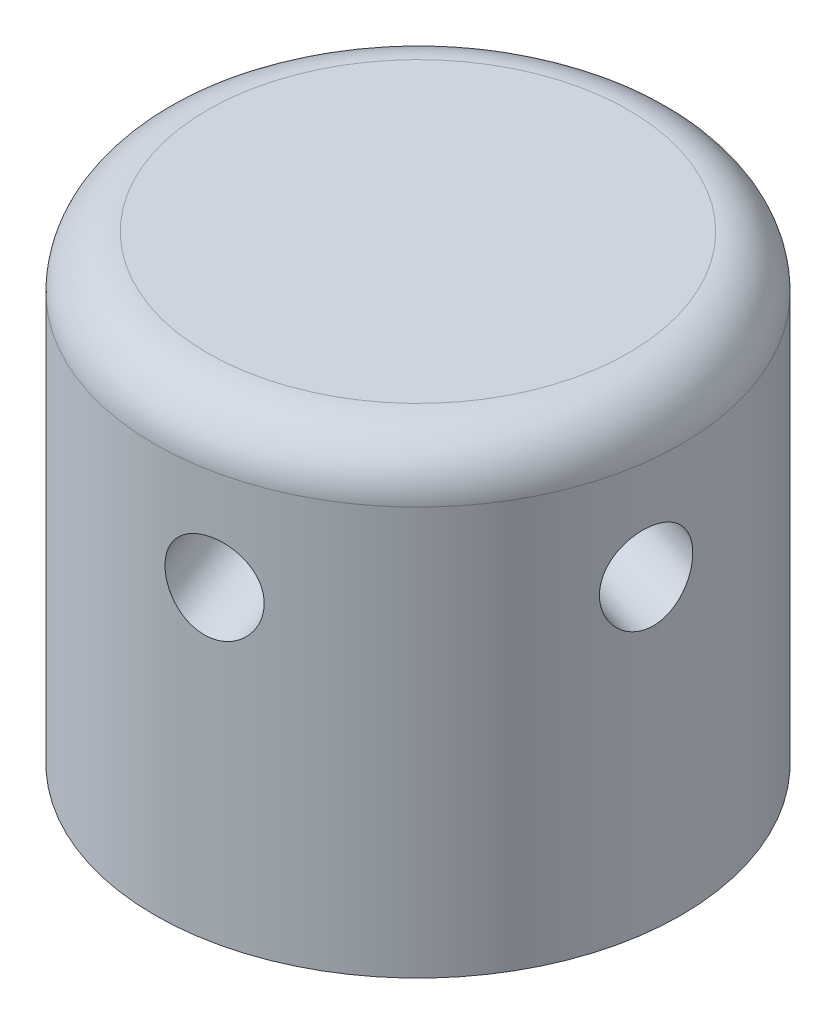
ISO-10303-21;
HEADER;
FILE_DESCRIPTION(('STEP AP214'),'2;1');
FILE_NAME('part.step','',(''),(''),'','','');
FILE_SCHEMA(('AUTOMOTIVE_DESIGN { 1 0 10303 214 1 1 1 1 }'));
ENDSEC;
DATA;
#1=APPLICATION_CONTEXT('core data for automotive mechanical design processes');
#2=APPLICATION_PROTOCOL_DEFINITION('international standard','automotive_design',2000,#1);
#3=PRODUCT_CONTEXT('',#1,'mechanical');
#4=PRODUCT('Part','Part','',(#3));
#5=PRODUCT_RELATED_PRODUCT_CATEGORY('part','',(#4));
#6=PRODUCT_DEFINITION_FORMATION('','',#4);
#7=PRODUCT_DEFINITION_CONTEXT('part definition',#1,'design');
#8=PRODUCT_DEFINITION('design','',#6,#7);
#9=PRODUCT_DEFINITION_SHAPE('','',#8);
#10=(LENGTH_UNIT() NAMED_UNIT(*) SI_UNIT(.MILLI.,.METRE.));
#11=(NAMED_UNIT(*) PLANE_ANGLE_UNIT() SI_UNIT($,.RADIAN.));
#12=(NAMED_UNIT(*) SI_UNIT($,.STERADIAN.) SOLID_ANGLE_UNIT());
#13=UNCERTAINTY_MEASURE_WITH_UNIT(LENGTH_MEASURE(1.E-05),#10,'distance_accuracy_value','');
#14=(GEOMETRIC_REPRESENTATION_CONTEXT(3) GLOBAL_UNCERTAINTY_ASSIGNED_CONTEXT((#13)) GLOBAL_UNIT_ASSIGNED_CONTEXT((#10,
#11,#12)) REPRESENTATION_CONTEXT('',''));
#15=CARTESIAN_POINT('',(0.,0.,0.));
#16=DIRECTION('',(0.,0.,1.));
#17=DIRECTION('',(1.,0.,0.));
#18=AXIS2_PLACEMENT_3D('',#15,#16,#17);
#19=CARTESIAN_POINT('',(0.,-6.,0.));
#20=DIRECTION('',(0.,1.,0.));
#21=DIRECTION('',(0.,0.,1.));
#22=AXIS2_PLACEMENT_3D('',#19,#20,#21);
#23=CYLINDRICAL_SURFACE('',#22,10.);
#24=CARTESIAN_POINT('',(0.,1.,0.));
#25=DIRECTION('',(0.,1.,0.));
#26=DIRECTION('',(0.,0.,1.));
#27=AXIS2_PLACEMENT_3D('',#24,#25,#26);
#28=CIRCLE('',#27,10.);
#29=CARTESIAN_POINT('',(0.,1.,10.));
#30=VERTEX_POINT('',#29);
#31=EDGE_CURVE('E10',#30,#30,#28,.F.);
#32=ORIENTED_EDGE('',*,*,#31,.T.);
#33=EDGE_LOOP('',(#32));
#34=FACE_BOUND('',#33,.T.);
#35=CARTESIAN_POINT('',(-6.18040658631982,-2.80419257592395,-7.8614613417465));
#36=CARTESIAN_POINT('',(-6.18041069378116,-2.90234784309518,-7.86145985033207));
#37=CARTESIAN_POINT('',(-6.18709037837394,-3.00057569421897,-7.85622071906424));
#38=CARTESIAN_POINT('',(-6.21328313433534,-3.19429375623175,-7.83552031582612));
#39=CARTESIAN_POINT('',(-6.23281569685475,-3.28977957900091,-7.82004351843738));
#40=CARTESIAN_POINT('',(-6.28376502842835,-3.47517276967888,-7.77916181257504));
#41=CARTESIAN_POINT('',(-6.31516706385408,-3.56508689335964,-7.75376921134334));
#42=CARTESIAN_POINT('',(-6.38865971296323,-3.73693258914234,-7.69332712533847));
#43=CARTESIAN_POINT('',(-6.4307480948599,-3.81886582307326,-7.65827965680337));
#44=CARTESIAN_POINT('',(-6.52448986893661,-3.97278415857681,-7.5785772815116));
#45=CARTESIAN_POINT('',(-6.57620342226979,-4.04470142029659,-7.53386164380033));
#46=CARTESIAN_POINT('',(-6.68725447470501,-4.17534392326118,-7.43546314485651));
#47=CARTESIAN_POINT('',(-6.74659001159406,-4.23407254914793,-7.38178259049963));
#48=CARTESIAN_POINT('',(-6.86747316238743,-4.33309816932697,-7.26940523116863));
#49=CARTESIAN_POINT('',(-6.92874101682425,-4.37420107240322,-7.21111983965897));
#50=CARTESIAN_POINT('',(-7.05399457373656,-4.44028699170343,-7.08863909005609));
#51=CARTESIAN_POINT('',(-7.1179783887015,-4.46528101377072,-7.02444780130276));
#52=CARTESIAN_POINT('',(-7.2408979989159,-4.4964619358335,-6.8975752553002));
#53=CARTESIAN_POINT('',(-7.2998114016746,-4.50403920222909,-6.835211852897));
#54=CARTESIAN_POINT('',(-7.41599656463583,-4.50415740699111,-6.70897494081218));
#55=CARTESIAN_POINT('',(-7.47326875792584,-4.49670234989006,-6.64510183778663));
#56=CARTESIAN_POINT('',(-7.58217917913624,-4.46774917979113,-6.52051620708892));
#57=CARTESIAN_POINT('',(-7.63395240425703,-4.44684381033082,-6.45978210248453));
#58=CARTESIAN_POINT('',(-7.73327325732892,-4.39246364343792,-6.34054506008151));
#59=CARTESIAN_POINT('',(-7.78082040703957,-4.35898742566933,-6.28204237522627));
#60=CARTESIAN_POINT('',(-7.87234067780815,-4.27943950635112,-6.1669959074082));
#61=CARTESIAN_POINT('',(-7.91614456968675,-4.23298937226029,-6.11058005058202));
#62=CARTESIAN_POINT('',(-7.99779809730484,-4.12962391405995,-6.00331398885442));
#63=CARTESIAN_POINT('',(-8.03564580230697,-4.0727052094075,-5.95246559029986));
#64=CARTESIAN_POINT('',(-8.10775604691805,-3.94529584290214,-5.85391396776607));
#65=CARTESIAN_POINT('',(-8.14151429694982,-3.87409566698231,-5.80675887231004));
#66=CARTESIAN_POINT('',(-8.20153607142322,-3.7234916320388,-5.72167140512811));
#67=CARTESIAN_POINT('',(-8.22779684344153,-3.64408477476704,-5.68374242118406));
#68=CARTESIAN_POINT('',(-8.27416487683236,-3.47360706993731,-5.61604816884507));
#69=CARTESIAN_POINT('',(-8.29374975039458,-3.38211206928312,-5.58698947660017));
#70=CARTESIAN_POINT('',(-8.32405447795391,-3.19457090082377,-5.54173833167562));
#71=CARTESIAN_POINT('',(-8.33477322064973,-3.09852416408824,-5.52554749189225));
#72=CARTESIAN_POINT('',(-8.34721005269621,-2.9032972349777,-5.50674303326532));
#73=CARTESIAN_POINT('',(-8.3488141503021,-2.80409289685924,-5.50430137103277));
#74=CARTESIAN_POINT('',(-8.34248086251898,-2.60668729118917,-5.51389588691072));
#75=CARTESIAN_POINT('',(-8.33454554272457,-2.50848581112888,-5.52592893077623));
#76=CARTESIAN_POINT('',(-8.30942286587974,-2.31961542955216,-5.56362998091201));
#77=CARTESIAN_POINT('',(-8.29257179549985,-2.22880300805648,-5.58880197157573));
#78=CARTESIAN_POINT('',(-8.24983112683427,-2.05390062311326,-5.65170093491985));
#79=CARTESIAN_POINT('',(-8.2239437144287,-1.96980903994349,-5.68942487119679));
#80=CARTESIAN_POINT('',(-8.16459239437144,-1.81433058777238,-5.77425211059514));
#81=CARTESIAN_POINT('',(-8.13148151790137,-1.74256485669541,-5.82090888833601));
#82=CARTESIAN_POINT('',(-8.05758249695944,-1.60987893076595,-5.92277904761302));
#83=CARTESIAN_POINT('',(-8.01679522194457,-1.54895750916636,-5.97799145998169));
#84=CARTESIAN_POINT('',(-7.9291356931972,-1.44084866104323,-6.09376440834493));
#85=CARTESIAN_POINT('',(-7.88240129647873,-1.39341115377824,-6.15419605110393));
#86=CARTESIAN_POINT('',(-7.78316118923601,-1.31197818446462,-6.27923276033472));
#87=CARTESIAN_POINT('',(-7.73065563818385,-1.27798235110665,-6.34383771146675));
#88=CARTESIAN_POINT('',(-7.62126393920933,-1.22444215000392,-6.47484261923763));
#89=CARTESIAN_POINT('',(-7.56439461267379,-1.20484509181928,-6.54123510023709));
#90=CARTESIAN_POINT('',(-7.44753128648001,-1.18040665367519,-6.67398645668238));
#91=CARTESIAN_POINT('',(-7.38753727259583,-1.17556534090098,-6.74034533197383));
#92=CARTESIAN_POINT('',(-7.26603697545491,-1.18076540289665,-6.87114840534427));
#93=CARTESIAN_POINT('',(-7.20452970867928,-1.1908167224365,-6.93559129467686));
#94=CARTESIAN_POINT('',(-7.08188582181877,-1.22556046932424,-7.06077720898353));
#95=CARTESIAN_POINT('',(-7.02074920150364,-1.25025288757539,-7.12152023625636));
#96=CARTESIAN_POINT('',(-6.90082161745449,-1.31362986693059,-7.23779262794899));
#97=CARTESIAN_POINT('',(-6.84203053304105,-1.3523137071329,-7.29332226080096));
#98=CARTESIAN_POINT('',(-6.72880950003165,-1.4426321301286,-7.39790984547475));
#99=CARTESIAN_POINT('',(-6.67437928718441,-1.49426592742231,-7.44696818954728));
#100=CARTESIAN_POINT('',(-6.57186287088399,-1.60901583583468,-7.53759282097776));
#101=CARTESIAN_POINT('',(-6.52377217819324,-1.67212374556233,-7.57916441768701));
#102=CARTESIAN_POINT('',(-6.43563400862007,-1.80807329481835,-7.65414747741365));
#103=CARTESIAN_POINT('',(-6.39558808462159,-1.88091680910276,-7.68755736524249));
#104=CARTESIAN_POINT('',(-6.32481099983414,-2.03460274266089,-7.74589484926247));
#105=CARTESIAN_POINT('',(-6.29412611305473,-2.11548235994557,-7.77078037939385));
#106=CARTESIAN_POINT('',(-6.24337632993539,-2.2825764910716,-7.8116145758641));
#107=CARTESIAN_POINT('',(-6.22330160238461,-2.36878598329015,-7.82757151610482));
#108=CARTESIAN_POINT('',(-6.19932412581324,-2.51357139572223,-7.84656075943516));
#109=CARTESIAN_POINT('',(-6.19222425836726,-2.57131759117338,-7.85215871739794));
#110=CARTESIAN_POINT('',(-6.18276429226737,-2.68743149130231,-7.85960943208847));
#111=CARTESIAN_POINT('',(-6.18040414275684,-2.74579918930468,-7.86146222900137));
#112=CARTESIAN_POINT('',(-6.18040658631982,-2.80419257592395,-7.8614613417465));
#113=B_SPLINE_CURVE_WITH_KNOTS('',3,(#35,#36,#37,#38,#39,#40,#41,#42,#43,#44,#45,#46,#47,#48,
#49,#50,#51,#52,#53,#54,#55,#56,#57,#58,#59,#60,#61,#62,#63,#64,#65,#66,#67,#68,#69,#70,#71,#72,
#73,#74,#75,#76,#77,#78,#79,#80,#81,#82,#83,#84,#85,#86,#87,#88,#89,#90,#91,#92,#93,#94,#95,#96,
#97,#98,#99,#100,#101,#102,#103,#104,#105,#106,#107,#108,#109,#110,#111,#112),.UNSPECIFIED.,.T.,
.F.,(4,2,2,2,2,2,2,2,2,2,2,2,2,2,2,2,2,2,2,2,2,2,2,2,2,2,2,2,2,2,2,2,2,2,2,2,2,2,4),(0.,
0.294247369480007,0.588941991186979,0.883272002128368,1.17754059429731,1.47371432417628,
1.76981195895846,2.05036159735739,2.33071935602934,2.58777759553048,2.84476736510533,
3.091142592679,3.33754566570429,3.59206194690359,3.84666056204866,4.12096676141902,
4.39537353311392,4.6879442991612,4.98055173114879,5.27681071896179,5.57300556860702,
5.85875072810492,6.1444268140438,6.41842323334606,6.69238863746758,6.9608803249332,
7.22936459513529,7.49686142113619,7.76435946509044,8.0320362152438,8.29971279908588,
8.56737559297647,8.83502215529133,9.10247815769814,9.36998573770895,9.63879501418435,
9.90735477750061,10.0824068686198,10.2574570814401),.UNSPECIFIED.);
#114=CARTESIAN_POINT('',(-6.18040658631982,-2.80419257592395,-7.8614613417465));
#115=VERTEX_POINT('',#114);
#116=EDGE_CURVE('E51',#115,#115,#113,.T.);
#117=ORIENTED_EDGE('',*,*,#116,.F.);
#118=EDGE_LOOP('',(#117));
#119=FACE_BOUND('',#118,.T.);
#120=CARTESIAN_POINT('',(5.56684336935079,-2.80419257592395,-8.30724111249428));
#121=CARTESIAN_POINT('',(5.56684068165602,-2.90234784309518,-8.30724455804975));
#122=CARTESIAN_POINT('',(5.5597938356678,-3.00057569421897,-8.31197833501099));
#123=CARTESIAN_POINT('',(5.53201257555666,-3.19429375623175,-8.33049234985681));
#124=CARTESIAN_POINT('',(5.51125737278652,-3.28977957900091,-8.34428632730922));
#125=CARTESIAN_POINT('',(5.4566323507206,-3.47517276967888,-8.38010887923268));
#126=CARTESIAN_POINT('',(5.42277878924899,-3.56508689335964,-8.40212724433727));
#127=CARTESIAN_POINT('',(5.34258447195922,-3.73693258914234,-8.45334527542134));
#128=CARTESIAN_POINT('',(5.29624632335746,-3.81886582307326,-8.48254344189732));
#129=CARTESIAN_POINT('',(5.19147705869946,-3.97278415857681,-8.54706777852483));
#130=CARTESIAN_POINT('',(5.13296959325439,-4.04470142029659,-8.58243239843604));
#131=CARTESIAN_POINT('',(5.0050703971945,-4.17534392326118,-8.65764141710136));
#132=CARTESIAN_POINT('',(4.93568146690598,-4.23407254914793,-8.69748466254382));
#133=CARTESIAN_POINT('',(4.79144929910144,-4.33309816932697,-8.77772485699988));
#134=CARTESIAN_POINT('',(4.7170837894715,-4.37420107240322,-8.81798287270117));
#135=CARTESIAN_POINT('',(4.56189219674915,-4.44028699170343,-8.89925745108069));
#136=CARTESIAN_POINT('',(4.48107056710181,-4.46528101377072,-8.94027347612491));
#137=CARTESIAN_POINT('',(4.32242335698893,-4.4964619358335,-9.01797119956537));
#138=CARTESIAN_POINT('',(4.24490699410614,-4.50403920222909,-9.05472982398652));
#139=CARTESIAN_POINT('',(4.08894536642164,-4.50415740699111,-9.12621912916599));
#140=CARTESIAN_POINT('',(4.01050035454146,-4.49670234989006,-9.16095034747861));
#141=CARTESIAN_POINT('',(3.85835720761111,-4.46774917979113,-9.2260312361227));
#142=CARTESIAN_POINT('',(3.78459683524983,-4.44684381033082,-9.25650262878254));
#143=CARTESIAN_POINT('',(3.64050383759365,-4.39246364343792,-9.31411610083902));
#144=CARTESIAN_POINT('',(3.57017160064663,-4.35898742566933,-9.34125780356576));
#145=CARTESIAN_POINT('',(3.43247458875423,-4.27943950635112,-9.39274743975472));
#146=CARTESIAN_POINT('',(3.36528377348706,-4.23298937226029,-9.41697395805344));
#147=CARTESIAN_POINT('',(3.23803535881906,-4.12962391405995,-9.46148404157961));
#148=CARTESIAN_POINT('',(3.17798007398682,-4.0727052094075,-9.48176632875859));
#149=CARTESIAN_POINT('',(3.06196862013124,-3.94529584290214,-9.51989312060143));
#150=CARTESIAN_POINT('',(3.00668958636109,-3.87409566698231,-9.53742739840558));
#151=CARTESIAN_POINT('',(2.90721884789784,-3.7234916320388,-9.56821802477057));
#152=CARTESIAN_POINT('',(2.86303121572234,-3.64408477476704,-9.58147280250344));
#153=CARTESIAN_POINT('',(2.78432164560611,-3.47360706993731,-9.60465274841332));
#154=CARTESIAN_POINT('',(2.75063312822817,-3.38211206928312,-9.61429944029751));
#155=CARTESIAN_POINT('',(2.69823205615212,-3.19457090082377,-9.62913757612075));
#156=CARTESIAN_POINT('',(2.67952137882051,-3.09852416408824,-9.63432846156183));
#157=CARTESIAN_POINT('',(2.65779408344942,-2.9032972349777,-9.64034569443597));
#158=CARTESIAN_POINT('',(2.6549762312517,-2.80409289685924,-9.64111676679244));
#159=CARTESIAN_POINT('',(2.66605825165337,-2.60668729118918,-9.63805832063582));
#160=CARTESIAN_POINT('',(2.67995450510481,-2.50848581112888,-9.63422979808496));
#161=CARTESIAN_POINT('',(2.72357366859686,-2.31961542955216,-9.62198697776265));
#162=CARTESIAN_POINT('',(2.7527209214665,-2.22880300805648,-9.61373923036864));
#163=CARTESIAN_POINT('',(2.82574898339175,-2.05390062311326,-9.59252728752533));
#164=CARTESIAN_POINT('',(2.86962622918195,-1.96980903994349,-9.57956423267128));
#165=CARTESIAN_POINT('',(2.96864229450736,-1.81433058777238,-9.54933083154011));
#166=CARTESIAN_POINT('',(3.02324735053505,-1.74256485669541,-9.5322582539377));
#167=CARTESIAN_POINT('',(3.1429676826702,-1.60987893076595,-9.49345571895933));
#168=CARTESIAN_POINT('',(3.20808176836764,-1.54895750916636,-9.47172628899688));
#169=CARTESIAN_POINT('',(3.34527666942103,-1.44084866104323,-9.42413293149946));
#170=CARTESIAN_POINT('',(3.41719229986527,-1.39341115377824,-9.39836028357576));
#171=CARTESIAN_POINT('',(3.56677615661691,-1.31197818446462,-9.34261580097778));
#172=CARTESIAN_POINT('',(3.64444422395009,-1.27798235110665,-9.31264408232851));
#173=CARTESIAN_POINT('',(3.80284118917892,-1.22444215000392,-9.24908913703792));
#174=CARTESIAN_POINT('',(3.88355777922459,-1.20484509181928,-9.21551959838653));
#175=CARTESIAN_POINT('',(4.04592457563197,-1.18040665367519,-9.14539839566193));
#176=CARTESIAN_POINT('',(4.12757478624289,-1.17556534090098,-9.10884671801134));
#177=CARTESIAN_POINT('',(4.28952155816144,-1.18076540289665,-9.03371344127161));
#178=CARTESIAN_POINT('',(4.36981717870131,-1.1908167224365,-8.99513050237554));
#179=CARTESIAN_POINT('',(4.52677510354713,-1.22556046932424,-8.91717380957021));
#180=CARTESIAN_POINT('',(4.60343741011047,-1.25025288757539,-8.87780005615232));
#181=CARTESIAN_POINT('',(4.75107868746049,-1.31362986693059,-8.79967229086849));
#182=CARTESIAN_POINT('',(4.82205795083332,-1.3523137071329,-8.76091824717969));
#183=CARTESIAN_POINT('',(4.95651387808148,-1.4426321301286,-8.68555798701926));
#184=CARTESIAN_POINT('',(5.01999099666755,-1.49426592742231,-8.64895164044187));
#185=CARTESIAN_POINT('',(5.1378594577656,-1.60901583583468,-8.57945728591311));
#186=CARTESIAN_POINT('',(5.19225723702143,-1.67212374556233,-8.54656664912289));
#187=CARTESIAN_POINT('',(5.29080655683742,-1.80807329481835,-8.48591330836175));
#188=CARTESIAN_POINT('',(5.3349561194367,-1.88091680910276,-8.45815159451121));
#189=CARTESIAN_POINT('',(5.41230968576981,-2.03460274266089,-8.40886586079098));
#190=CARTESIAN_POINT('',(5.44545938284803,-2.11548235994557,-8.38737285099227));
#191=CARTESIAN_POINT('',(5.49997755693345,-2.2825764910716,-8.35172539971701));
#192=CARTESIAN_POINT('',(5.52135694090016,-2.36878598329015,-8.3375641649796));
#193=CARTESIAN_POINT('',(5.54682623225177,-2.51357139572223,-8.32062822854148));
#194=CARTESIAN_POINT('',(5.55434418634884,-2.57131759117338,-8.31560571748645));
#195=CARTESIAN_POINT('',(5.5643535273974,-2.68743149130231,-8.30891115254283));
#196=CARTESIAN_POINT('',(5.56684496828281,-2.74579918930467,-8.30723906270461));
#197=CARTESIAN_POINT('',(5.56684336935079,-2.80419257592395,-8.30724111249428));
#198=B_SPLINE_CURVE_WITH_KNOTS('',3,(#120,#121,#122,#123,#124,#125,#126,#127,#128,#129,#130,
#131,#132,#133,#134,#135,#136,#137,#138,#139,#140,#141,#142,#143,#144,#145,#146,#147,#148,#149,
#150,#151,#152,#153,#154,#155,#156,#157,#158,#159,#160,#161,#162,#163,#164,#165,#166,#167,#168,
#169,#170,#171,#172,#173,#174,#175,#176,#177,#178,#179,#180,#181,#182,#183,#184,#185,#186,#187,
#188,#189,#190,#191,#192,#193,#194,#195,#196,#197),.UNSPECIFIED.,.T.,.F.,(4,2,2,2,2,2,2,2,2,2,2,
2,2,2,2,2,2,2,2,2,2,2,2,2,2,2,2,2,2,2,2,2,2,2,2,2,2,2,4),(0.,0.294247369480007,
0.588941991186979,0.883272002128369,1.17754059429731,1.47371432417628,1.76981195895846,
2.05036159735739,2.33071935602934,2.58777759553048,2.84476736510533,3.091142592679,
3.33754566570429,3.59206194690359,3.84666056204865,4.12096676141902,4.39537353311392,
4.6879442991612,4.98055173114879,5.27681071896179,5.57300556860702,5.85875072810493,
6.1444268140438,6.41842323334606,6.69238863746758,6.9608803249332,7.22936459513529,
7.49686142113619,7.76435946509044,8.0320362152438,8.29971279908588,8.56737559297647,
8.83502215529133,9.10247815769814,9.36998573770895,9.63879501418435,9.90735477750061,
10.0824068686198,10.2574570814401),.UNSPECIFIED.);
#199=CARTESIAN_POINT('',(5.56684336935079,-2.80419257592395,-8.30724111249428));
#200=VERTEX_POINT('',#199);
#201=EDGE_CURVE('E58',#200,#200,#198,.T.);
#202=ORIENTED_EDGE('',*,*,#201,.F.);
#203=EDGE_LOOP('',(#202));
#204=FACE_BOUND('',#203,.T.);
#205=CARTESIAN_POINT('',(9.92735308998561,-4.50322630338943,1.20318769390029));
#206=CARTESIAN_POINT('',(9.93747158086751,-4.50611583843854,1.11968976236709));
#207=CARTESIAN_POINT('',(9.94656365977674,-4.50178304837939,1.03576684298313));
#208=CARTESIAN_POINT('',(9.9624661113616,-4.47884815399744,0.869629076678414));
#209=CARTESIAN_POINT('',(9.96927428677865,-4.46023236479396,0.787415945583453));
#210=CARTESIAN_POINT('',(9.98062867071901,-4.40963627823444,0.627282609305299));
#211=CARTESIAN_POINT('',(9.98518021682377,-4.37768784959331,0.549352665483974));
#212=CARTESIAN_POINT('',(9.99229678886943,-4.30173146568903,0.399548007862778));
#213=CARTESIAN_POINT('',(9.99486174569541,-4.25772309092354,0.327673504813696));
#214=CARTESIAN_POINT('',(9.99846782325065,-4.15722061048359,0.188834448148186));
#215=CARTESIAN_POINT('',(9.99944461795647,-4.10030129130652,0.122176792796474));
#216=CARTESIAN_POINT('',(10.000191736081,-3.97687044676209,-0.00157118390889282));
#217=CARTESIAN_POINT('',(9.99996165377224,-3.91035570291724,-0.0586582811790618));
#218=CARTESIAN_POINT('',(9.99877298805763,-3.76384268192975,-0.166355199607757));
#219=CARTESIAN_POINT('',(9.99775735406143,-3.68319042631406,-0.216075988456209));
#220=CARTESIAN_POINT('',(9.99553162089881,-3.51496774271233,-0.301993473386273));
#221=CARTESIAN_POINT('',(9.994321459765,-3.42739511474905,-0.338185847680939));
#222=CARTESIAN_POINT('',(9.99214475836298,-3.24336619318965,-0.397457240081453));
#223=CARTESIAN_POINT('',(9.99119221933799,-3.1466860486199,-0.419845630271941));
#224=CARTESIAN_POINT('',(9.98997443116463,-2.95091352349595,-0.447898162480002));
#225=CARTESIAN_POINT('',(9.98970915334956,-2.85182124372955,-0.453563002063254));
#226=CARTESIAN_POINT('',(9.98997568776477,-2.65525702638746,-0.447654862845942));
#227=CARTESIAN_POINT('',(9.99049850373749,-2.55777945013346,-0.436276445782735));
#228=CARTESIAN_POINT('',(9.99215335482241,-2.36634287483814,-0.396564915311679));
#229=CARTESIAN_POINT('',(9.99328522731719,-2.27238294374863,-0.368236327354412));
#230=CARTESIAN_POINT('',(9.99565636177197,-2.09496299673918,-0.29675815295416));
#231=CARTESIAN_POINT('',(9.99688892730428,-2.01122538412609,-0.254297055812373));
#232=CARTESIAN_POINT('',(9.99891334558655,-1.85241205398823,-0.15544858565793));
#233=CARTESIAN_POINT('',(9.99970528156228,-1.77733470284466,-0.0990638454394953));
#234=CARTESIAN_POINT('',(10.0001535387467,-1.64051789357053,0.0238823714026653));
#235=CARTESIAN_POINT('',(9.99984675535424,-1.57841786272032,0.0900429836730085));
#236=CARTESIAN_POINT('',(9.99756202838942,-1.46630729881969,0.23189170496111));
#237=CARTESIAN_POINT('',(9.99558420163241,-1.4162959210183,0.307579147684775));
#238=CARTESIAN_POINT('',(9.9894764346614,-1.33027339058666,0.465306593080012));
#239=CARTESIAN_POINT('',(9.98537168516191,-1.2941067981997,0.547262868864093));
#240=CARTESIAN_POINT('',(9.97469882670128,-1.23592461440921,0.715901872032833));
#241=CARTESIAN_POINT('',(9.96813073798167,-1.21390890673034,0.802584560575034));
#242=CARTESIAN_POINT('',(9.95243946460123,-1.18461552438532,0.978112721952867));
#243=CARTESIAN_POINT('',(9.94331817823612,-1.17732693310918,1.0669565433517));
#244=CARTESIAN_POINT('',(9.92268067853598,-1.17764248148586,1.24433950491424));
#245=CARTESIAN_POINT('',(9.9111644558854,-1.18524667906793,1.33287864389147));
#246=CARTESIAN_POINT('',(9.88615666531998,-1.21516102778183,1.50720523339001));
#247=CARTESIAN_POINT('',(9.87266392129036,-1.23747996268658,1.59299100823057));
#248=CARTESIAN_POINT('',(9.8443798474004,-1.29624869601392,1.75934922279337));
#249=CARTESIAN_POINT('',(9.82958853329444,-1.33269832301985,1.83992172574296));
#250=CARTESIAN_POINT('',(9.79958146819504,-1.41872943258444,1.99357342171471));
#251=CARTESIAN_POINT('',(9.78436595790433,-1.46830359828222,2.06665675851568));
#252=CARTESIAN_POINT('',(9.75448615573963,-1.57922779388592,2.20338517182545));
#253=CARTESIAN_POINT('',(9.73982184666737,-1.64057745601468,2.26703054299466));
#254=CARTESIAN_POINT('',(9.71204281917471,-1.77334593453038,2.3832340763728));
#255=CARTESIAN_POINT('',(9.69892869479173,-1.84476858808605,2.43578799430921));
#256=CARTESIAN_POINT('',(9.67517431857508,-1.99561388433194,2.52849769883648));
#257=CARTESIAN_POINT('',(9.66453409775658,-2.07503662730087,2.5686533299929));
#258=CARTESIAN_POINT('',(9.64636774595636,-2.24043354768507,2.63606282413499));
#259=CARTESIAN_POINT('',(9.63887350834762,-2.32646483157541,2.66318493730356));
#260=CARTESIAN_POINT('',(9.62763461524281,-2.50195468590873,2.7035333093719));
#261=CARTESIAN_POINT('',(9.62389048520026,-2.59141373481684,2.71675762096731));
#262=CARTESIAN_POINT('',(9.62028554157676,-2.77404457649806,2.72949698535217));
#263=CARTESIAN_POINT('',(9.62054338150975,-2.86724772045195,2.72859315038128));
#264=CARTESIAN_POINT('',(9.62512160451679,-3.05229313121454,2.71239749907065));
#265=CARTESIAN_POINT('',(9.62944296169443,-3.14413506635284,2.69710223282622));
#266=CARTESIAN_POINT('',(9.64203841119566,-3.32803733023408,2.65173003156967));
#267=CARTESIAN_POINT('',(9.65047469065912,-3.41993678405649,2.62104497712594));
#268=CARTESIAN_POINT('',(9.67069145979926,-3.59730393228497,2.54543724825957));
#269=CARTESIAN_POINT('',(9.68247270396796,-3.68277017010274,2.50051136140061));
#270=CARTESIAN_POINT('',(9.70881886923832,-3.84670132949995,2.39620308017121));
#271=CARTESIAN_POINT('',(9.72344054533483,-3.92496503751464,2.33651768067541));
#272=CARTESIAN_POINT('',(9.75422250490331,-4.06967581198045,2.20447803636209));
#273=CARTESIAN_POINT('',(9.77038291520708,-4.13612190305521,2.13212274680237));
#274=CARTESIAN_POINT('',(9.80248646043133,-4.25247409998337,1.97917783489853));
#275=CARTESIAN_POINT('',(9.81841739257082,-4.3028778508246,1.8989652082616));
#276=CARTESIAN_POINT('',(9.84949876089979,-4.38788221630196,1.73050781058989));
#277=CARTESIAN_POINT('',(9.8646505948503,-4.42251207536418,1.64227827016818));
#278=CARTESIAN_POINT('',(9.88779604627379,-4.46447792520214,1.49492175671137));
#279=CARTESIAN_POINT('',(9.89633516158305,-4.47718169552662,1.43735988808217));
#280=CARTESIAN_POINT('',(9.91253806276659,-4.49553453526019,1.32099860608937));
#281=CARTESIAN_POINT('',(9.92020191554303,-4.50118414419441,1.26219928771976));
#282=CARTESIAN_POINT('',(9.92735308998561,-4.50322630338943,1.20318769390029));
#283=B_SPLINE_CURVE_WITH_KNOTS('',3,(#205,#206,#207,#208,#209,#210,#211,#212,#213,#214,#215,
#216,#217,#218,#219,#220,#221,#222,#223,#224,#225,#226,#227,#228,#229,#230,#231,#232,#233,#234,
#235,#236,#237,#238,#239,#240,#241,#242,#243,#244,#245,#246,#247,#248,#249,#250,#251,#252,#253,
#254,#255,#256,#257,#258,#259,#260,#261,#262,#263,#264,#265,#266,#267,#268,#269,#270,#271,#272,
#273,#274,#275,#276,#277,#278,#279,#280,#281,#282),.UNSPECIFIED.,.T.,.F.,(4,2,2,2,2,2,2,2,2,2,2,
2,2,2,2,2,2,2,2,2,2,2,2,2,2,2,2,2,2,2,2,2,2,2,2,2,2,2,4),(0.,0.252248403203044,0.50473879386721,
0.756629088117827,1.00852814542465,1.27039654907248,1.53235299318959,1.8153580038218,
2.09845334611585,2.39475726963461,2.69104883367463,2.98398368367868,3.27684035918863,
3.55712444850328,3.83735557997979,4.10826598771179,4.37915745884014,4.6469115111212,
4.9146633632858,5.18221666901757,5.44977101546732,5.71748521982135,5.98519617668867,
6.25275819925242,6.5203118665682,6.78796773148794,7.05562695181105,7.325937691841,
7.59628630168278,7.87466534218203,8.15311113253284,8.44354639949903,8.73404722931547,
9.03109548314861,9.32816824272804,9.6148399080652,9.9009779057113,10.0792663817537,
10.2575412208797),.UNSPECIFIED.);
#284=CARTESIAN_POINT('',(9.92735308998561,-4.50322630338943,1.20318769390029));
#285=VERTEX_POINT('',#284);
#286=EDGE_CURVE('E93',#285,#285,#283,.T.);
#287=ORIENTED_EDGE('',*,*,#286,.F.);
#288=EDGE_LOOP('',(#287));
#289=FACE_BOUND('',#288,.T.);
#290=CARTESIAN_POINT('',(1.8869488312424,-1.17988271041713,9.820357636475));
#291=CARTESIAN_POINT('',(1.79945112973037,-1.18475788519567,9.83716851436081));
#292=CARTESIAN_POINT('',(1.71207388780583,-1.1970615964251,9.85273427537302));
#293=CARTESIAN_POINT('',(1.54011446951967,-1.23623501154644,9.88107607464319));
#294=CARTESIAN_POINT('',(1.45553513038818,-1.26311904764654,9.8938493505731));
#295=CARTESIAN_POINT('',(1.29172968985668,-1.33074121411888,9.91656548624668));
#296=CARTESIAN_POINT('',(1.21250170286714,-1.37147443377837,9.92650934696596));
#297=CARTESIAN_POINT('',(1.06173684355278,-1.46568816415508,9.94376591611577));
#298=CARTESIAN_POINT('',(0.990198215564106,-1.51916575601907,9.95107922606232));
#299=CARTESIAN_POINT('',(0.856928562793338,-1.63736917986167,9.96344117134831));
#300=CARTESIAN_POINT('',(0.795194342733254,-1.70209133275477,9.96849054549149));
#301=CARTESIAN_POINT('',(0.68328916963773,-1.84095631188058,9.97678675316516));
#302=CARTESIAN_POINT('',(0.633118430497758,-1.91509931233605,9.98003355335411));
#303=CARTESIAN_POINT('',(0.545463334213141,-2.07109010181131,9.98520987540477));
#304=CARTESIAN_POINT('',(0.508047312370339,-2.15297648026065,9.98713235637642));
#305=CARTESIAN_POINT('',(0.447138725622041,-2.32178014588872,9.99004511315271));
#306=CARTESIAN_POINT('',(0.423647416805992,-2.40869788614929,9.99103530486424));
#307=CARTESIAN_POINT('',(0.390591417550573,-2.58715311039519,9.99238320734883));
#308=CARTESIAN_POINT('',(0.381350410993514,-2.67875046191643,9.9927262563929));
#309=CARTESIAN_POINT('',(0.377720989293566,-2.86223482854569,9.99286381786895));
#310=CARTESIAN_POINT('',(0.383335721731672,-2.95412190091889,9.99265821405422));
#311=CARTESIAN_POINT('',(0.409498262249908,-3.13958461146535,9.99162097134035));
#312=CARTESIAN_POINT('',(0.430648645751802,-3.23307511652322,9.9907640208221));
#313=CARTESIAN_POINT('',(0.487770991347369,-3.41541140782257,9.98813748471376));
#314=CARTESIAN_POINT('',(0.523746946708113,-3.50425593539916,9.98636765320688));
#315=CARTESIAN_POINT('',(0.61102164830908,-3.67793018914257,9.98141395066469));
#316=CARTESIAN_POINT('',(0.662807753092569,-3.76251443694909,9.97818324657079));
#317=CARTESIAN_POINT('',(0.779887302249498,-3.92167683340661,9.96971466213185));
#318=CARTESIAN_POINT('',(0.845181587810698,-3.99625435843725,9.96447665676988));
#319=CARTESIAN_POINT('',(0.986696434114059,-4.13189888314325,9.95145224670999));
#320=CARTESIAN_POINT('',(1.06275908429531,-4.19313332764407,9.94370088320829));
#321=CARTESIAN_POINT('',(1.22439088781583,-4.30081455654523,9.92509236242018));
#322=CARTESIAN_POINT('',(1.30995475224262,-4.34726951292676,9.91423692778642));
#323=CARTESIAN_POINT('',(1.48149520274686,-4.42039515155083,9.89000123370738));
#324=CARTESIAN_POINT('',(1.56700117290235,-4.44824673456581,9.87685818054688));
#325=CARTESIAN_POINT('',(1.74117212114859,-4.48785940730089,9.8476440814622));
#326=CARTESIAN_POINT('',(1.82983527128239,-4.49962965729237,9.83157470834974));
#327=CARTESIAN_POINT('',(2.00061640842381,-4.50620850746607,9.79819054534492));
#328=CARTESIAN_POINT('',(2.08272613451838,-4.50222396319129,9.78105977801961));
#329=CARTESIAN_POINT('',(2.24465436031334,-4.48016765933825,9.7451732958157));
#330=CARTESIAN_POINT('',(2.3244730679195,-4.46209718225012,9.72641772900934));
#331=CARTESIAN_POINT('',(2.4786521356151,-4.41300188845494,9.68826715227286));
#332=CARTESIAN_POINT('',(2.55306887208699,-4.38214423029697,9.66888326539049));
#333=CARTESIAN_POINT('',(2.69584433373164,-4.30871265039763,9.63005220169523));
#334=CARTESIAN_POINT('',(2.7642017989999,-4.26613629950782,9.61060501258733));
#335=CARTESIAN_POINT('',(2.89714975163433,-4.16803837314638,9.57139471127444));
#336=CARTESIAN_POINT('',(2.96131666972515,-4.11192663970629,9.55167460859289));
#337=CARTESIAN_POINT('',(3.08028130015328,-3.99002612270598,9.51397759575605));
#338=CARTESIAN_POINT('',(3.13507556550246,-3.92423379538252,9.49600132797994));
#339=CARTESIAN_POINT('',(3.23839582013824,-3.77916184450483,9.46128964444992));
#340=CARTESIAN_POINT('',(3.28607166204278,-3.69922470291531,9.4447679979217));
#341=CARTESIAN_POINT('',(3.36861333681781,-3.53231996698333,9.41564471149395));
#342=CARTESIAN_POINT('',(3.40347519681208,-3.44535020240932,9.40304428752458));
#343=CARTESIAN_POINT('',(3.46100545316147,-3.26225642729358,9.38202713505441));
#344=CARTESIAN_POINT('',(3.48300099583673,-3.16589303513736,9.37384277009261));
#345=CARTESIAN_POINT('',(3.51136017725102,-2.97057074708831,9.36325710649527));
#346=CARTESIAN_POINT('',(3.51772416167656,-2.87161190864178,9.36085567997208));
#347=CARTESIAN_POINT('',(3.51433178540988,-2.6749381347884,9.36212990295936));
#348=CARTESIAN_POINT('',(3.50472924620439,-2.57722036376153,9.36574756478833));
#349=CARTESIAN_POINT('',(3.46954388654891,-2.38510669647371,9.37883870164833));
#350=CARTESIAN_POINT('',(3.44396531298001,-2.29070992443957,9.38831062044557));
#351=CARTESIAN_POINT('',(3.37861378028614,-2.1122239181654,9.41201963799943));
#352=CARTESIAN_POINT('',(3.33949209244676,-2.02786686659047,9.42603649247039));
#353=CARTESIAN_POINT('',(3.24775543901786,-1.86767474776899,9.45803536700821));
#354=CARTESIAN_POINT('',(3.19514350676156,-1.79183777025694,9.47601649556559));
#355=CARTESIAN_POINT('',(3.07977465382465,-1.65347380868961,9.51412324241499));
#356=CARTESIAN_POINT('',(3.01742430032603,-1.59058146667273,9.53415496109062));
#357=CARTESIAN_POINT('',(2.88299644381022,-1.47678152203921,9.57566018822197));
#358=CARTESIAN_POINT('',(2.81091766961876,-1.42587548801578,9.5971338849107));
#359=CARTESIAN_POINT('',(2.6599187612638,-1.33802625594269,9.64006834607164));
#360=CARTESIAN_POINT('',(2.58108928316139,-1.30092554630175,9.66152627940089));
#361=CARTESIAN_POINT('',(2.41807071745498,-1.24086915211944,9.70360732041632));
#362=CARTESIAN_POINT('',(2.33388706771279,-1.21789936112565,9.72423124138736));
#363=CARTESIAN_POINT('',(2.18892071746701,-1.19146477335558,9.75768152617976));
#364=CARTESIAN_POINT('',(2.12890975904827,-1.18417271969729,9.77095423583315));
#365=CARTESIAN_POINT('',(2.00822954382959,-1.17669311347785,9.79646967199437));
#366=CARTESIAN_POINT('',(1.94756028556266,-1.17650557675206,9.8087123962064));
#367=CARTESIAN_POINT('',(1.8869488312424,-1.17988271041713,9.820357636475));
#368=B_SPLINE_CURVE_WITH_KNOTS('',3,(#290,#291,#292,#293,#294,#295,#296,#297,#298,#299,#300,
#301,#302,#303,#304,#305,#306,#307,#308,#309,#310,#311,#312,#313,#314,#315,#316,#317,#318,#319,
#320,#321,#322,#323,#324,#325,#326,#327,#328,#329,#330,#331,#332,#333,#334,#335,#336,#337,#338,
#339,#340,#341,#342,#343,#344,#345,#346,#347,#348,#349,#350,#351,#352,#353,#354,#355,#356,#357,
#358,#359,#360,#361,#362,#363,#364,#365,#366,#367),.UNSPECIFIED.,.T.,.F.,(4,2,2,2,2,2,2,2,2,2,2,
2,2,2,2,2,2,2,2,2,2,2,2,2,2,2,2,2,2,2,2,2,2,2,2,2,2,2,4),(0.,0.267469811619867,
0.535203019253906,0.802841391544759,1.07041852522662,1.33790827518966,1.60540297264682,
1.87430908120209,2.14323944294974,2.41819277890536,2.69320437565799,2.97948684341757,
3.26584647179837,3.56211992190501,3.85841182724718,4.15073869864069,4.4429036524975,
4.71409391774852,4.98512964272775,5.23582093139192,5.48648939788596,5.73397953571808,
5.98152101405834,6.24288684630809,6.50434859557287,6.78669252311201,7.06912391551495,
7.36524356240143,7.6613566606451,7.95463350173544,8.24783241472102,8.52853798326313,
8.80918048934631,9.08026442131184,9.35138380909724,9.61930742364079,9.88696314259754,
10.0722445597595,10.2575263898977),.UNSPECIFIED.);
#369=CARTESIAN_POINT('',(1.8869488312424,-1.17988271041713,9.820357636475));
#370=VERTEX_POINT('',#369);
#371=EDGE_CURVE('E99',#370,#370,#368,.T.);
#372=ORIENTED_EDGE('',*,*,#371,.F.);
#373=EDGE_LOOP('',(#372));
#374=FACE_BOUND('',#373,.T.);
#375=CARTESIAN_POINT('',(-9.38654470399012,-2.80419257592395,3.44859080205164));
#376=CARTESIAN_POINT('',(-9.38654455484606,-2.90234784309518,3.44859516935191));
#377=CARTESIAN_POINT('',(-9.38362598097031,-3.00057569421897,3.45656690750819));
#378=CARTESIAN_POINT('',(-9.37203273430235,-3.19429375623175,3.487874475136));
#379=CARTESIAN_POINT('',(-9.36334931905659,-3.28977957900091,3.51123363941165));
#380=CARTESIAN_POINT('',(-9.34021271560724,-3.47517276967888,3.57232247507611));
#381=CARTESIAN_POINT('',(-9.32576667934466,-3.56508689335964,3.61003433080466));
#382=CARTESIAN_POINT('',(-9.29099331712761,-3.73693258914234,3.69860762539069));
#383=CARTESIAN_POINT('',(-9.27066721906947,-3.81886582307326,3.74946631864099));
#384=CARTESIAN_POINT('',(-9.22383355695659,-3.97278415857681,3.86324943218292));
#385=CARTESIAN_POINT('',(-9.19728682515046,-4.04470142029659,3.92624983602832));
#386=CARTESIAN_POINT('',(-9.13802095398199,-4.17534392326119,4.0622724714829));
#387=CARTESIAN_POINT('',(-9.10530340223162,-4.23407254914793,4.13529212405285));
#388=CARTESIAN_POINT('',(-9.03578113028456,-4.33309816932697,4.28498534614143));
#389=CARTESIAN_POINT('',(-8.99928123711436,-4.37420107240322,4.36126571484327));
#390=CARTESIAN_POINT('',(-8.92150059977564,-4.44028699170343,4.51823755944494));
#391=CARTESIAN_POINT('',(-8.88022314250651,-4.46528101377073,4.59892598272038));
#392=CARTESIAN_POINT('',(-8.79754442939001,-4.4964619358335,4.75503525182965));
#393=CARTESIAN_POINT('',(-8.75643855180501,-4.5040392022291,4.83033657859006));
#394=CARTESIAN_POINT('',(-8.672283303819,-4.50415740699111,4.97984458607279));
#395=CARTESIAN_POINT('',(-8.6292344540023,-4.49670234989006,5.05405155302212));
#396=CARTESIAN_POINT('',(-8.54440164910905,-4.46774917979113,5.19613059594724));
#397=CARTESIAN_POINT('',(-8.50263888957961,-4.44684381033082,5.26413772952888));
#398=CARTESIAN_POINT('',(-8.41992955491349,-4.39246364343792,5.39544374650843));
#399=CARTESIAN_POINT('',(-8.37898307255584,-4.35898742566933,5.45874209690884));
#400=CARTESIAN_POINT('',(-8.29784869865801,-4.27943950635112,5.58133436049499));
#401=CARTESIAN_POINT('',(-8.25773017741134,-4.23298937226029,5.64042779581673));
#402=CARTESIAN_POINT('',(-8.18094641811264,-4.12962391405996,5.7512319513299));
#403=CARTESIAN_POINT('',(-8.1442823013679,-4.0727052094075,5.80294027708911));
#404=CARTESIAN_POINT('',(-8.07283742961904,-3.94529584290214,5.90197532130427));
#405=CARTESIAN_POINT('',(-8.03842214176924,-3.87409566698231,5.948653050843));
#406=CARTESIAN_POINT('',(-7.97604689999563,-3.7234916320388,6.03203062394306));
#407=CARTESIAN_POINT('',(-7.94808931749826,-3.64408477476704,6.0687268029121));
#408=CARTESIAN_POINT('',(-7.89803676800905,-3.47360706993731,6.13374409761049));
#409=CARTESIAN_POINT('',(-7.87645236815793,-3.38211206928312,6.16135004897064));
#410=CARTESIAN_POINT('',(-7.84278064773336,-3.19457090082377,6.20415493038711));
#411=CARTESIAN_POINT('',(-7.83069451770443,-3.09852416408824,6.21935230512072));
#412=CARTESIAN_POINT('',(-7.81665360725043,-2.9032972349777,6.23699133256634));
#413=CARTESIAN_POINT('',(-7.81482714189443,-2.80409289685925,6.23927143517157));
#414=CARTESIAN_POINT('',(-7.8219949751856,-2.60668729118918,6.23028325209678));
#415=CARTESIAN_POINT('',(-7.83098693129249,-2.50848581112889,6.21901789944892));
#416=CARTESIAN_POINT('',(-7.85907942660605,-2.31961542955216,6.18347454873112));
#417=CARTESIAN_POINT('',(-7.8778121452341,-2.22880300805648,6.15966965554244));
#418=CARTESIAN_POINT('',(-7.92442502122213,-2.05390062311326,6.09958401549534));
#419=CARTESIAN_POINT('',(-7.9523029662649,-1.96980903994349,6.0633062858327));
#420=CARTESIAN_POINT('',(-8.01463789851775,-1.81433058777238,5.98064676758153));
#421=CARTESIAN_POINT('',(-8.04877930748964,-1.74256485669541,5.93473871552971));
#422=CARTESIAN_POINT('',(-8.12282753294734,-1.60987893076595,5.83297695967879));
#423=CARTESIAN_POINT('',(-8.1627336963771,-1.54895750916636,5.77712438227162));
#424=CARTESIAN_POINT('',(-8.24575202922682,-1.44084866104323,5.65797940770794));
#425=CARTESIAN_POINT('',(-8.28878421405532,-1.39341115377824,5.59485795056319));
#426=CARTESIAN_POINT('',(-8.37703431148377,-1.31197818446462,5.46183653181914));
#427=CARTESIAN_POINT('',(-8.42225216366868,-1.27798235110665,5.39193675752875));
#428=CARTESIAN_POINT('',(-8.51304134084415,-1.22444215000392,5.2474163265427));
#429=CARTESIAN_POINT('',(-8.55861075417355,-1.20484509181928,5.17281397803622));
#430=CARTESIAN_POINT('',(-8.6487520429548,-1.18040665367519,5.02064792497577));
#431=CARTESIAN_POINT('',(-8.69332391386377,-1.17556534090098,4.94308420693986));
#432=CARTESIAN_POINT('',(-8.78017937250602,-1.18076540289665,4.78711018502425));
#433=CARTESIAN_POINT('',(-8.82246141162344,-1.1908167224365,4.70869935018739));
#434=CARTESIAN_POINT('',(-8.90362124587707,-1.22556046932424,4.55337350742781));
#435=CARTESIAN_POINT('',(-8.94249904312836,-1.25025288757539,4.47645849857575));
#436=CARTESIAN_POINT('',(-9.01602099734735,-1.31362986693059,4.32647044327263));
#437=CARTESIAN_POINT('',(-9.05066537231721,-1.3523137071329,4.25339719909851));
#438=CARTESIAN_POINT('',(-9.11514685292419,-1.4426321301286,4.11339825680843));
#439=CARTESIAN_POINT('',(-9.14498424995578,-1.49426592742231,4.04647218616243));
#440=CARTESIAN_POINT('',(-9.19949408137533,-1.60901583583468,3.9209687291917));
#441=CARTESIAN_POINT('',(-9.22417017800576,-1.67212374556233,3.86238543266855));
#442=CARTESIAN_POINT('',(-9.26824711331932,-1.80807329481835,3.75539001241589));
#443=CARTESIAN_POINT('',(-9.28764693377664,-1.88091680910276,3.70697985232681));
#444=CARTESIAN_POINT('',(-9.32125785608648,-2.03460274266089,3.62163957066408));
#445=CARTESIAN_POINT('',(-9.33544325019408,-2.11548235994557,3.58476645741611));
#446=CARTESIAN_POINT('',(-9.35859633339007,-2.2825764910716,3.52388208481895));
#447=CARTESIAN_POINT('',(-9.3675688534155,-2.36878598329015,3.49985891865632));
#448=CARTESIAN_POINT('',(-9.37821924928155,-2.51357139572223,3.47118698441941));
#449=CARTESIAN_POINT('',(-9.38134924398139,-2.57131759117338,3.46270474507578));
#450=CARTESIAN_POINT('',(-9.3855120044478,-2.68743149130231,3.45140538521294));
#451=CARTESIAN_POINT('',(-9.38654479271716,-2.74579918930467,3.4485882039083));
#452=CARTESIAN_POINT('',(-9.38654470399012,-2.80419257592395,3.44859080205164));
#453=B_SPLINE_CURVE_WITH_KNOTS('',3,(#375,#376,#377,#378,#379,#380,#381,#382,#383,#384,#385,
#386,#387,#388,#389,#390,#391,#392,#393,#394,#395,#396,#397,#398,#399,#400,#401,#402,#403,#404,
#405,#406,#407,#408,#409,#410,#411,#412,#413,#414,#415,#416,#417,#418,#419,#420,#421,#422,#423,
#424,#425,#426,#427,#428,#429,#430,#431,#432,#433,#434,#435,#436,#437,#438,#439,#440,#441,#442,
#443,#444,#445,#446,#447,#448,#449,#450,#451,#452),.UNSPECIFIED.,.T.,.F.,(4,2,2,2,2,2,2,2,2,2,2,
2,2,2,2,2,2,2,2,2,2,2,2,2,2,2,2,2,2,2,2,2,2,2,2,2,2,2,4),(0.,0.294247369480007,
0.588941991186979,0.883272002128369,1.17754059429731,1.47371432417628,1.76981195895846,
2.05036159735739,2.33071935602934,2.58777759553048,2.84476736510533,3.091142592679,
3.33754566570429,3.59206194690359,3.84666056204865,4.12096676141902,4.39537353311392,
4.6879442991612,4.98055173114879,5.27681071896179,5.57300556860702,5.85875072810492,
6.1444268140438,6.41842323334606,6.69238863746758,6.9608803249332,7.22936459513529,
7.49686142113619,7.76435946509044,8.0320362152438,8.29971279908588,8.56737559297647,
8.83502215529133,9.10247815769814,9.36998573770895,9.63879501418435,9.90735477750061,
10.0824068686198,10.2574570814401),.UNSPECIFIED.);
#454=CARTESIAN_POINT('',(-9.38654470399012,-2.80419257592395,3.44859080205164));
#455=VERTEX_POINT('',#454);
#456=EDGE_CURVE('E44',#455,#455,#453,.T.);
#457=ORIENTED_EDGE('',*,*,#456,.F.);
#458=EDGE_LOOP('',(#457));
#459=FACE_BOUND('',#458,.T.);
#460=CARTESIAN_POINT('',(0.,-14.5,0.));
#461=DIRECTION('',(0.,-1.,0.));
#462=DIRECTION('',(0.,0.,-1.));
#463=AXIS2_PLACEMENT_3D('',#460,#461,#462);
#464=CIRCLE('',#463,10.);
#465=CARTESIAN_POINT('',(0.,-14.5,-10.));
#466=VERTEX_POINT('',#465);
#467=EDGE_CURVE('E143',#466,#466,#464,.T.);
#468=ORIENTED_EDGE('',*,*,#467,.F.);
#469=EDGE_LOOP('',(#468));
#470=FACE_BOUND('',#469,.T.);
#471=ADVANCED_FACE('F33',(#34,#119,#204,#289,#374,#459,#470),#23,.T.);
#472=CARTESIAN_POINT('',(0.,3.,0.));
#473=DIRECTION('',(0.,1.,0.));
#474=DIRECTION('',(0.,0.,1.));
#475=AXIS2_PLACEMENT_3D('',#472,#473,#474);
#476=PLANE('',#475);
#477=CARTESIAN_POINT('',(0.,3.,0.));
#478=DIRECTION('',(0.,1.,0.));
#479=DIRECTION('',(0.,0.,1.));
#480=AXIS2_PLACEMENT_3D('',#477,#478,#479);
#481=CIRCLE('',#480,8.);
#482=CARTESIAN_POINT('',(0.,3.,8.));
#483=VERTEX_POINT('',#482);
#484=EDGE_CURVE('E40',#483,#483,#481,.T.);
#485=ORIENTED_EDGE('',*,*,#484,.T.);
#486=EDGE_LOOP('',(#485));
#487=FACE_BOUND('',#486,.T.);
#488=ADVANCED_FACE('F121',(#487),#476,.T.);
#489=CARTESIAN_POINT('',(-12.3562209238066,-4.02823787655252,6.95671678823708));
#490=DIRECTION('',(0.838218026294095,0.273266528912668,-0.471927901878724));
#491=DIRECTION('',(-0.490600980883989,0.,-0.871384345484625));
#492=AXIS2_PLACEMENT_3D('',#489,#490,#491);
#493=CYLINDRICAL_SURFACE('',#492,1.6);
#494=ORIENTED_EDGE('',*,*,#456,.T.);
#495=EDGE_LOOP('',(#494));
#496=FACE_BOUND('',#495,.T.);
#497=CARTESIAN_POINT('',(-3.35287210517514,-1.09306611565059,1.88771160751546));
#498=DIRECTION('',(0.838218026294095,0.273266528912668,-0.471927901878724));
#499=DIRECTION('',(-0.490600980883989,0.,-0.871384345484625));
#500=AXIS2_PLACEMENT_3D('',#497,#498,#499);
#501=CIRCLE('',#500,1.6);
#502=CARTESIAN_POINT('',(-4.13783367458953,-1.09306611565059,0.493496654740065));
#503=VERTEX_POINT('',#502);
#504=EDGE_CURVE('E48',#503,#503,#501,.T.);
#505=ORIENTED_EDGE('',*,*,#504,.T.);
#506=EDGE_LOOP('',(#505));
#507=FACE_BOUND('',#506,.T.);
#508=ADVANCED_FACE('F117',(#496,#507),#493,.F.);
#509=CARTESIAN_POINT('',(-3.35287210517514,-1.09306611565059,1.88771160751546));
#510=DIRECTION('',(0.838218026294095,0.273266528912668,-0.471927901878724));
#511=DIRECTION('',(-0.490600980883989,0.,-0.871384345484625));
#512=AXIS2_PLACEMENT_3D('',#509,#510,#511);
#513=PLANE('',#512);
#514=ORIENTED_EDGE('',*,*,#504,.F.);
#515=EDGE_LOOP('',(#514));
#516=FACE_BOUND('',#515,.T.);
#517=ADVANCED_FACE('F114',(#516),#513,.F.);
#518=CARTESIAN_POINT('',(2.46139703752163,-3.54370085297402,12.2290998320235));
#519=DIRECTION('',(-0.189806491186948,0.273266528912668,-0.943026457783302));
#520=DIRECTION('',(0.,0.960486645664299,0.278326074058007));
#521=AXIS2_PLACEMENT_3D('',#518,#519,#520);
#522=CYLINDRICAL_SURFACE('',#521,1.6);
#523=ORIENTED_EDGE('',*,*,#371,.T.);
#524=EDGE_LOOP('',(#523));
#525=FACE_BOUND('',#524,.T.);
#526=CARTESIAN_POINT('',(0.759225964748714,-1.09306611565059,3.77210583113221));
#527=DIRECTION('',(-0.189806491186948,0.273266528912668,-0.943026457783302));
#528=DIRECTION('',(-0.980339800520913,0.,0.197316688383461));
#529=AXIS2_PLACEMENT_3D('',#526,#527,#528);
#530=CIRCLE('',#529,1.6);
#531=CARTESIAN_POINT('',(-0.809317716084748,-1.09306611565059,4.08781253254575));
#532=VERTEX_POINT('',#531);
#533=EDGE_CURVE('E145',#532,#532,#530,.T.);
#534=ORIENTED_EDGE('',*,*,#533,.T.);
#535=EDGE_LOOP('',(#534));
#536=FACE_BOUND('',#535,.T.);
#537=ADVANCED_FACE('F110',(#525,#536),#522,.F.);
#538=CARTESIAN_POINT('',(0.759225964748714,-1.09306611565059,3.77210583113221));
#539=DIRECTION('',(-0.189806491186948,0.273266528912668,-0.943026457783302));
#540=DIRECTION('',(-0.980339800520913,0.,0.197316688383461));
#541=AXIS2_PLACEMENT_3D('',#538,#539,#540);
#542=PLANE('',#541);
#543=ORIENTED_EDGE('',*,*,#533,.F.);
#544=EDGE_LOOP('',(#543));
#545=FACE_BOUND('',#544,.T.);
#546=ADVANCED_FACE('F90',(#545),#542,.F.);
#547=CARTESIAN_POINT('',(11.756580516794,-3.36221482689139,1.36442299775273));
#548=DIRECTION('',(-0.955524889132991,0.273266528912668,-0.110894501321781));
#549=DIRECTION('',(-0.274962446743328,-0.961454966642184,0.));
#550=AXIS2_PLACEMENT_3D('',#547,#548,#549);
#551=CYLINDRICAL_SURFACE('',#550,1.6);
#552=ORIENTED_EDGE('',*,*,#286,.T.);
#553=EDGE_LOOP('',(#552));
#554=FACE_BOUND('',#553,.T.);
#555=CARTESIAN_POINT('',(3.8220995565313,-1.09306611565059,0.443578005285939));
#556=DIRECTION('',(-0.955524889132991,0.273266528912668,-0.110894501321781));
#557=DIRECTION('',(-0.115282336362235,0.,0.993332765453181));
#558=AXIS2_PLACEMENT_3D('',#555,#556,#557);
#559=CIRCLE('',#558,1.6);
#560=CARTESIAN_POINT('',(3.63764781835173,-1.09306611565059,2.03291043001103));
#561=VERTEX_POINT('',#560);
#562=EDGE_CURVE('E149',#561,#561,#559,.T.);
#563=ORIENTED_EDGE('',*,*,#562,.T.);
#564=EDGE_LOOP('',(#563));
#565=FACE_BOUND('',#564,.T.);
#566=ADVANCED_FACE('F85',(#554,#565),#551,.F.);
#567=CARTESIAN_POINT('',(3.8220995565313,-1.09306611565059,0.443578005285939));
#568=DIRECTION('',(-0.955524889132991,0.273266528912668,-0.110894501321781));
#569=DIRECTION('',(-0.115282336362235,0.,0.993332765453181));
#570=AXIS2_PLACEMENT_3D('',#567,#568,#569);
#571=PLANE('',#570);
#572=ORIENTED_EDGE('',*,*,#562,.F.);
#573=EDGE_LOOP('',(#572));
#574=FACE_BOUND('',#573,.T.);
#575=ADVANCED_FACE('F81',(#574),#571,.F.);
#576=CARTESIAN_POINT('',(5.76741598093171,-3.932825026226,-12.5855725019712));
#577=DIRECTION('',(-0.400740367393711,0.273266528912668,0.874489886800971));
#578=DIRECTION('',(0.909091398346555,0.,0.416596722805527));
#579=AXIS2_PLACEMENT_3D('',#576,#577,#578);
#580=CYLINDRICAL_SURFACE('',#579,1.6);
#581=ORIENTED_EDGE('',*,*,#201,.T.);
#582=EDGE_LOOP('',(#581));
#583=FACE_BOUND('',#582,.T.);
#584=CARTESIAN_POINT('',(1.60296146957351,-1.09306611565059,-3.49795954720362));
#585=DIRECTION('',(-0.400740367393711,0.273266528912668,0.874489886800971));
#586=DIRECTION('',(0.909091398346555,0.,0.416596722805527));
#587=AXIS2_PLACEMENT_3D('',#584,#585,#586);
#588=CIRCLE('',#587,1.6);
#589=CARTESIAN_POINT('',(3.057507706928,-1.09306611565059,-2.83140479071478));
#590=VERTEX_POINT('',#589);
#591=EDGE_CURVE('E158',#590,#590,#588,.T.);
#592=ORIENTED_EDGE('',*,*,#591,.T.);
#593=EDGE_LOOP('',(#592));
#594=FACE_BOUND('',#593,.T.);
#595=ADVANCED_FACE('F76',(#583,#594),#580,.F.);
#596=CARTESIAN_POINT('',(1.60296146957351,-1.09306611565059,-3.49795954720362));
#597=DIRECTION('',(-0.400740367393711,0.273266528912668,0.874489886800971));
#598=DIRECTION('',(0.909091398346555,0.,0.416596722805527));
#599=AXIS2_PLACEMENT_3D('',#596,#597,#598);
#600=PLANE('',#599);
#601=ORIENTED_EDGE('',*,*,#591,.F.);
#602=EDGE_LOOP('',(#601));
#603=FACE_BOUND('',#602,.T.);
#604=ADVANCED_FACE('F72',(#603),#600,.F.);
#605=CARTESIAN_POINT('',(-10.7818340244107,-4.16232092875695,-9.92132150674392));
#606=DIRECTION('',(0.70785372141956,0.273266528912668,0.651358974182825));
#607=DIRECTION('',(0.677131719420571,0.,-0.735861831157549));
#608=AXIS2_PLACEMENT_3D('',#605,#606,#607);
#609=CYLINDRICAL_SURFACE('',#608,1.6);
#610=ORIENTED_EDGE('',*,*,#116,.T.);
#611=EDGE_LOOP('',(#610));
#612=FACE_BOUND('',#611,.T.);
#613=CARTESIAN_POINT('',(-2.8314148856784,-1.09306611565059,-2.60543589672995));
#614=DIRECTION('',(0.70785372141956,0.273266528912668,0.651358974182825));
#615=DIRECTION('',(0.677131719420571,0.,-0.735861831157549));
#616=AXIS2_PLACEMENT_3D('',#613,#614,#615);
#617=CIRCLE('',#616,1.6);
#618=CARTESIAN_POINT('',(-1.74800413460549,-1.09306611565059,-3.78281482658203));
#619=VERTEX_POINT('',#618);
#620=EDGE_CURVE('E104',#619,#619,#617,.T.);
#621=ORIENTED_EDGE('',*,*,#620,.T.);
#622=EDGE_LOOP('',(#621));
#623=FACE_BOUND('',#622,.T.);
#624=ADVANCED_FACE('F66',(#612,#623),#609,.F.);
#625=CARTESIAN_POINT('',(-2.8314148856784,-1.09306611565059,-2.60543589672995));
#626=DIRECTION('',(0.70785372141956,0.273266528912668,0.651358974182825));
#627=DIRECTION('',(0.677131719420571,0.,-0.735861831157549));
#628=AXIS2_PLACEMENT_3D('',#625,#626,#627);
#629=PLANE('',#628);
#630=ORIENTED_EDGE('',*,*,#620,.F.);
#631=EDGE_LOOP('',(#630));
#632=FACE_BOUND('',#631,.T.);
#633=ADVANCED_FACE('F71',(#632),#629,.F.);
#634=CARTESIAN_POINT('',(0.,1.,0.));
#635=DIRECTION('',(0.,1.,0.));
#636=DIRECTION('',(0.,0.,1.));
#637=AXIS2_PLACEMENT_3D('',#634,#635,#636);
#638=TOROIDAL_SURFACE('',#637,8.,2.);
#639=ORIENTED_EDGE('',*,*,#31,.F.);
#640=EDGE_LOOP('',(#639));
#641=FACE_BOUND('',#640,.T.);
#642=ORIENTED_EDGE('',*,*,#484,.F.);
#643=EDGE_LOOP('',(#642));
#644=FACE_BOUND('',#643,.T.);
#645=ADVANCED_FACE('F35',(#641,#644),#638,.T.);
#646=CARTESIAN_POINT('',(0.,-14.5,0.));
#647=DIRECTION('',(0.,-1.,0.));
#648=DIRECTION('',(0.,0.,-1.));
#649=AXIS2_PLACEMENT_3D('',#646,#647,#648);
#650=PLANE('',#649);
#651=CARTESIAN_POINT('',(0.,-14.5,0.));
#652=DIRECTION('',(0.,-1.,0.));
#653=DIRECTION('',(0.,0.,-1.));
#654=AXIS2_PLACEMENT_3D('',#651,#652,#653);
#655=CIRCLE('',#654,2.);
#656=CARTESIAN_POINT('',(0.,-14.5,-2.));
#657=VERTEX_POINT('',#656);
#658=EDGE_CURVE('E152',#657,#657,#655,.T.);
#659=ORIENTED_EDGE('',*,*,#658,.F.);
#660=EDGE_LOOP('',(#659));
#661=FACE_BOUND('',#660,.T.);
#662=ORIENTED_EDGE('',*,*,#467,.T.);
#663=EDGE_LOOP('',(#662));
#664=FACE_BOUND('',#663,.T.);
#665=ADVANCED_FACE('F176',(#661,#664),#650,.T.);
#666=CARTESIAN_POINT('',(0.,-3.4,0.));
#667=DIRECTION('',(0.,-1.,0.));
#668=DIRECTION('',(0.,0.,-1.));
#669=AXIS2_PLACEMENT_3D('',#666,#667,#668);
#670=CYLINDRICAL_SURFACE('',#669,2.);
#671=CARTESIAN_POINT('',(0.,-3.4,0.));
#672=DIRECTION('',(0.,-1.,0.));
#673=DIRECTION('',(0.,0.,-1.));
#674=AXIS2_PLACEMENT_3D('',#671,#672,#673);
#675=CIRCLE('',#674,2.);
#676=CARTESIAN_POINT('',(0.,-3.4,-2.));
#677=VERTEX_POINT('',#676);
#678=EDGE_CURVE('E146',#677,#677,#675,.T.);
#679=ORIENTED_EDGE('',*,*,#678,.F.);
#680=EDGE_LOOP('',(#679));
#681=FACE_BOUND('',#680,.T.);
#682=ORIENTED_EDGE('',*,*,#658,.T.);
#683=EDGE_LOOP('',(#682));
#684=FACE_BOUND('',#683,.T.);
#685=ADVANCED_FACE('F182',(#681,#684),#670,.F.);
#686=CARTESIAN_POINT('',(0.,-3.4,0.));
#687=DIRECTION('',(0.,-1.,0.));
#688=DIRECTION('',(0.,0.,-1.));
#689=AXIS2_PLACEMENT_3D('',#686,#687,#688);
#690=PLANE('',#689);
#691=ORIENTED_EDGE('',*,*,#678,.T.);
#692=EDGE_LOOP('',(#691));
#693=FACE_BOUND('',#692,.T.);
#694=ADVANCED_FACE('F188',(#693),#690,.T.);
#695=CLOSED_SHELL('',(#471,#488,#508,#517,#537,#546,#566,#575,#595,#604,#624,#633,#645,#665,
#685,#694));
#696=MANIFOLD_SOLID_BREP('B2',#695);
#697=ADVANCED_BREP_SHAPE_REPRESENTATION('',(#18,#696),#14);
#698=SHAPE_DEFINITION_REPRESENTATION(#9,#697);
ENDSEC;
END-ISO-10303-21;
